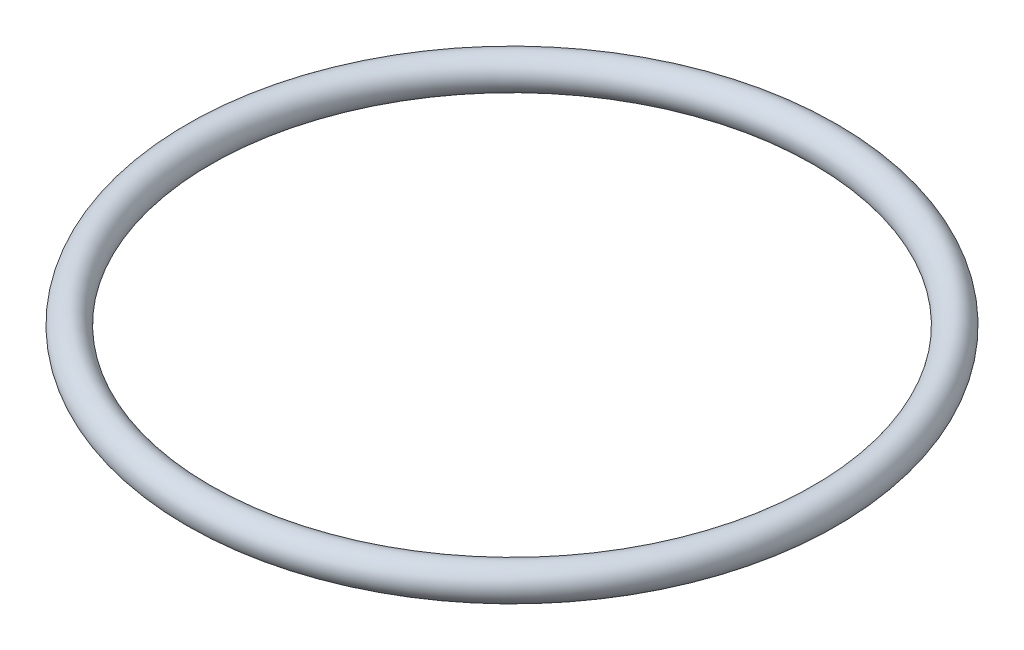
ISO-10303-21;
HEADER;
FILE_DESCRIPTION(('STEP AP214'),'2;1');
FILE_NAME('part.step','',(''),(''),'','','');
FILE_SCHEMA(('AUTOMOTIVE_DESIGN { 1 0 10303 214 1 1 1 1 }'));
ENDSEC;
DATA;
#1=APPLICATION_CONTEXT('core data for automotive mechanical design processes');
#2=APPLICATION_PROTOCOL_DEFINITION('international standard','automotive_design',2000,#1);
#3=PRODUCT_CONTEXT('',#1,'mechanical');
#4=PRODUCT('Part','Part','',(#3));
#5=PRODUCT_RELATED_PRODUCT_CATEGORY('part','',(#4));
#6=PRODUCT_DEFINITION_FORMATION('','',#4);
#7=PRODUCT_DEFINITION_CONTEXT('part definition',#1,'design');
#8=PRODUCT_DEFINITION('design','',#6,#7);
#9=PRODUCT_DEFINITION_SHAPE('','',#8);
#10=(LENGTH_UNIT() NAMED_UNIT(*) SI_UNIT(.MILLI.,.METRE.));
#11=(NAMED_UNIT(*) PLANE_ANGLE_UNIT() SI_UNIT($,.RADIAN.));
#12=(NAMED_UNIT(*) SI_UNIT($,.STERADIAN.) SOLID_ANGLE_UNIT());
#13=UNCERTAINTY_MEASURE_WITH_UNIT(LENGTH_MEASURE(1.E-05),#10,'distance_accuracy_value','');
#14=(GEOMETRIC_REPRESENTATION_CONTEXT(3) GLOBAL_UNCERTAINTY_ASSIGNED_CONTEXT((#13)) GLOBAL_UNIT_ASSIGNED_CONTEXT((#10,
#11,#12)) REPRESENTATION_CONTEXT('',''));
#15=CARTESIAN_POINT('',(0.,0.,0.));
#16=DIRECTION('',(0.,0.,1.));
#17=DIRECTION('',(1.,0.,0.));
#18=AXIS2_PLACEMENT_3D('',#15,#16,#17);
#19=CARTESIAN_POINT('',(0.,0.,0.));
#20=DIRECTION('',(0.,-1.,0.));
#21=DIRECTION('',(0.,0.,-1.));
#22=AXIS2_PLACEMENT_3D('',#19,#20,#21);
#23=TOROIDAL_SURFACE('',#22,28.5,1.5);
#24=CARTESIAN_POINT('',(0.,0.,-30.));
#25=VERTEX_POINT('',#24);
#26=VERTEX_LOOP('',#25);
#27=FACE_BOUND('',#26,.T.);
#28=ADVANCED_FACE('F30',(#27),#23,.T.);
#29=CLOSED_SHELL('',(#28));
#30=MANIFOLD_SOLID_BREP('B2',#29);
#31=ADVANCED_BREP_SHAPE_REPRESENTATION('',(#18,#30),#14);
#32=SHAPE_DEFINITION_REPRESENTATION(#9,#31);
ENDSEC;
END-ISO-10303-21;
